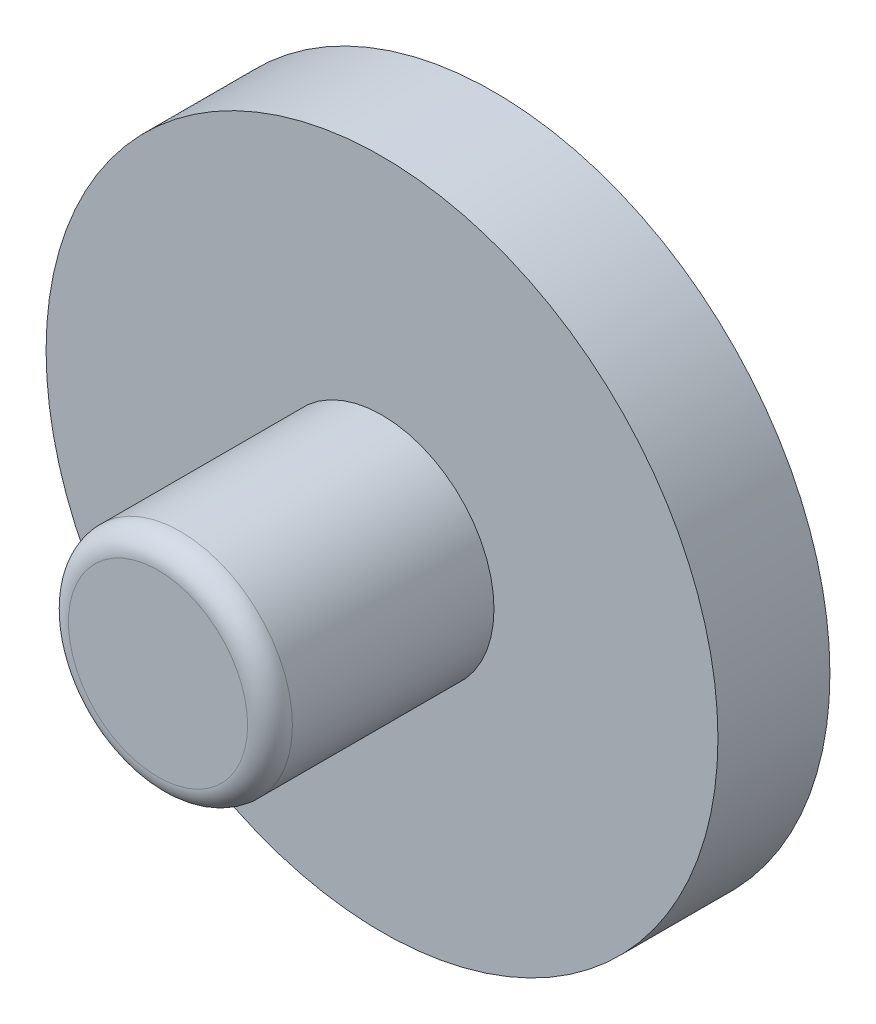
ISO-10303-21;
HEADER;
FILE_DESCRIPTION(('STEP AP214'),'2;1');
FILE_NAME('part.step','',(''),(''),'','','');
FILE_SCHEMA(('AUTOMOTIVE_DESIGN { 1 0 10303 214 1 1 1 1 }'));
ENDSEC;
DATA;
#1=APPLICATION_CONTEXT('core data for automotive mechanical design processes');
#2=APPLICATION_PROTOCOL_DEFINITION('international standard','automotive_design',2000,#1);
#3=PRODUCT_CONTEXT('',#1,'mechanical');
#4=PRODUCT('Part','Part','',(#3));
#5=PRODUCT_RELATED_PRODUCT_CATEGORY('part','',(#4));
#6=PRODUCT_DEFINITION_FORMATION('','',#4);
#7=PRODUCT_DEFINITION_CONTEXT('part definition',#1,'design');
#8=PRODUCT_DEFINITION('design','',#6,#7);
#9=PRODUCT_DEFINITION_SHAPE('','',#8);
#10=(LENGTH_UNIT() NAMED_UNIT(*) SI_UNIT(.MILLI.,.METRE.));
#11=(NAMED_UNIT(*) PLANE_ANGLE_UNIT() SI_UNIT($,.RADIAN.));
#12=(NAMED_UNIT(*) SI_UNIT($,.STERADIAN.) SOLID_ANGLE_UNIT());
#13=UNCERTAINTY_MEASURE_WITH_UNIT(LENGTH_MEASURE(1.E-05),#10,'distance_accuracy_value','');
#14=(GEOMETRIC_REPRESENTATION_CONTEXT(3) GLOBAL_UNCERTAINTY_ASSIGNED_CONTEXT((#13)) GLOBAL_UNIT_ASSIGNED_CONTEXT((#10,
#11,#12)) REPRESENTATION_CONTEXT('',''));
#15=CARTESIAN_POINT('',(0.,0.,0.));
#16=DIRECTION('',(0.,0.,1.));
#17=DIRECTION('',(1.,0.,0.));
#18=AXIS2_PLACEMENT_3D('',#15,#16,#17);
#19=CARTESIAN_POINT('',(0.,0.,1.00000000000003));
#20=DIRECTION('',(0.,0.,1.));
#21=DIRECTION('',(1.,0.,0.));
#22=AXIS2_PLACEMENT_3D('',#19,#20,#21);
#23=PLANE('',#22);
#24=CARTESIAN_POINT('',(0.,0.,1.00000000000003));
#25=DIRECTION('',(0.,0.,1.));
#26=DIRECTION('',(1.,0.,0.));
#27=AXIS2_PLACEMENT_3D('',#24,#25,#26);
#28=CIRCLE('',#27,3.);
#29=CARTESIAN_POINT('',(-3.00000000000002,0.,1.00000000000003));
#30=VERTEX_POINT('',#29);
#31=EDGE_CURVE('E42',#30,#30,#28,.T.);
#32=ORIENTED_EDGE('',*,*,#31,.T.);
#33=EDGE_LOOP('',(#32));
#34=FACE_BOUND('',#33,.T.);
#35=CARTESIAN_POINT('',(0.,0.,1.00000000000003));
#36=DIRECTION('',(0.,0.,1.));
#37=DIRECTION('',(1.,0.,0.));
#38=AXIS2_PLACEMENT_3D('',#35,#36,#37);
#39=CIRCLE('',#38,1.);
#40=CARTESIAN_POINT('',(-1.,0.,1.00000000000003));
#41=VERTEX_POINT('',#40);
#42=EDGE_CURVE('E51',#41,#41,#39,.T.);
#43=ORIENTED_EDGE('',*,*,#42,.F.);
#44=EDGE_LOOP('',(#43));
#45=FACE_BOUND('',#44,.T.);
#46=ADVANCED_FACE('F31',(#34,#45),#23,.T.);
#47=CARTESIAN_POINT('',(0.,0.,1.00000000000003));
#48=DIRECTION('',(0.,0.,-1.));
#49=DIRECTION('',(-1.,0.,0.));
#50=AXIS2_PLACEMENT_3D('',#47,#48,#49);
#51=CYLINDRICAL_SURFACE('',#50,3.);
#52=CARTESIAN_POINT('',(0.,0.,0.));
#53=DIRECTION('',(0.,0.,1.));
#54=DIRECTION('',(1.,0.,0.));
#55=AXIS2_PLACEMENT_3D('',#52,#53,#54);
#56=CIRCLE('',#55,3.);
#57=CARTESIAN_POINT('',(-3.00000000000002,0.,0.));
#58=VERTEX_POINT('',#57);
#59=EDGE_CURVE('E46',#58,#58,#56,.T.);
#60=CARTESIAN_POINT('',(-3.00000000000002,0.,1.00000000000003));
#61=CARTESIAN_POINT('',(-3.00000000000002,0.,0.989583333333361));
#62=CARTESIAN_POINT('',(-3.00000000000002,0.,0.979166666666694));
#63=CARTESIAN_POINT('',(-3.00000000000002,0.,0.95833333333336));
#64=CARTESIAN_POINT('',(-3.00000000000002,0.,0.947916666666693));
#65=CARTESIAN_POINT('',(-3.00000000000002,0.,0.927083333333359));
#66=CARTESIAN_POINT('',(-3.00000000000002,0.,0.916666666666692));
#67=CARTESIAN_POINT('',(-3.00000000000002,0.,0.895833333333358));
#68=CARTESIAN_POINT('',(-3.00000000000002,0.,0.885416666666691));
#69=CARTESIAN_POINT('',(-3.00000000000002,0.,0.864583333333357));
#70=CARTESIAN_POINT('',(-3.00000000000002,0.,0.85416666666669));
#71=CARTESIAN_POINT('',(-3.00000000000002,0.,0.833333333333356));
#72=CARTESIAN_POINT('',(-3.00000000000002,0.,0.82291666666669));
#73=CARTESIAN_POINT('',(-3.00000000000002,0.,0.802083333333356));
#74=CARTESIAN_POINT('',(-3.00000000000002,0.,0.791666666666689));
#75=CARTESIAN_POINT('',(-3.00000000000002,0.,0.770833333333355));
#76=CARTESIAN_POINT('',(-3.00000000000002,0.,0.760416666666688));
#77=CARTESIAN_POINT('',(-3.00000000000002,0.,0.739583333333354));
#78=CARTESIAN_POINT('',(-3.00000000000002,0.,0.729166666666687));
#79=CARTESIAN_POINT('',(-3.00000000000002,0.,0.708333333333353));
#80=CARTESIAN_POINT('',(-3.00000000000002,0.,0.697916666666686));
#81=CARTESIAN_POINT('',(-3.00000000000002,0.,0.677083333333352));
#82=CARTESIAN_POINT('',(-3.00000000000002,0.,0.666666666666685));
#83=CARTESIAN_POINT('',(-3.00000000000002,0.,0.645833333333351));
#84=CARTESIAN_POINT('',(-3.00000000000002,0.,0.635416666666684));
#85=CARTESIAN_POINT('',(-3.00000000000002,0.,0.61458333333335));
#86=CARTESIAN_POINT('',(-3.00000000000002,0.,0.604166666666683));
#87=CARTESIAN_POINT('',(-3.00000000000002,0.,0.583333333333349));
#88=CARTESIAN_POINT('',(-3.00000000000002,0.,0.572916666666682));
#89=CARTESIAN_POINT('',(-3.00000000000002,0.,0.552083333333349));
#90=CARTESIAN_POINT('',(-3.00000000000002,0.,0.541666666666682));
#91=CARTESIAN_POINT('',(-3.00000000000002,0.,0.520833333333348));
#92=CARTESIAN_POINT('',(-3.00000000000002,0.,0.510416666666681));
#93=CARTESIAN_POINT('',(-3.00000000000002,0.,0.489583333333347));
#94=CARTESIAN_POINT('',(-3.00000000000002,0.,0.47916666666668));
#95=CARTESIAN_POINT('',(-3.00000000000002,0.,0.458333333333346));
#96=CARTESIAN_POINT('',(-3.00000000000002,0.,0.447916666666679));
#97=CARTESIAN_POINT('',(-3.00000000000002,0.,0.427083333333345));
#98=CARTESIAN_POINT('',(-3.00000000000002,0.,0.416666666666678));
#99=CARTESIAN_POINT('',(-3.00000000000002,0.,0.395833333333344));
#100=CARTESIAN_POINT('',(-3.00000000000002,0.,0.385416666666677));
#101=CARTESIAN_POINT('',(-3.00000000000002,0.,0.364583333333343));
#102=CARTESIAN_POINT('',(-3.00000000000002,0.,0.354166666666676));
#103=CARTESIAN_POINT('',(-3.00000000000002,0.,0.333333333333342));
#104=CARTESIAN_POINT('',(-3.00000000000002,0.,0.322916666666675));
#105=CARTESIAN_POINT('',(-3.00000000000002,0.,0.302083333333341));
#106=CARTESIAN_POINT('',(-3.00000000000002,0.,0.291666666666674));
#107=CARTESIAN_POINT('',(-3.00000000000002,0.,0.27083333333334));
#108=CARTESIAN_POINT('',(-3.00000000000002,0.,0.260416666666674));
#109=CARTESIAN_POINT('',(-3.00000000000002,0.,0.23958333333334));
#110=CARTESIAN_POINT('',(-3.00000000000002,0.,0.229166666666673));
#111=CARTESIAN_POINT('',(-3.00000000000002,0.,0.208333333333339));
#112=CARTESIAN_POINT('',(-3.00000000000002,0.,0.197916666666672));
#113=CARTESIAN_POINT('',(-3.00000000000002,0.,0.177083333333338));
#114=CARTESIAN_POINT('',(-3.00000000000002,0.,0.166666666666671));
#115=CARTESIAN_POINT('',(-3.00000000000002,0.,0.145833333333337));
#116=CARTESIAN_POINT('',(-3.00000000000002,0.,0.13541666666667));
#117=CARTESIAN_POINT('',(-3.00000000000002,0.,0.114583333333336));
#118=CARTESIAN_POINT('',(-3.00000000000002,0.,0.104166666666669));
#119=CARTESIAN_POINT('',(-3.00000000000002,0.,0.0833333333333352));
#120=CARTESIAN_POINT('',(-3.00000000000002,0.,0.0729166666666682));
#121=CARTESIAN_POINT('',(-3.00000000000002,0.,0.0520833333333343));
#122=CARTESIAN_POINT('',(-3.00000000000002,0.,0.0416666666666673));
#123=CARTESIAN_POINT('',(-3.00000000000002,0.,0.0208333333333333));
#124=CARTESIAN_POINT('',(-3.00000000000002,0.,0.0104166666666664));
#125=CARTESIAN_POINT('',(-3.00000000000002,0.,0.));
#126=B_SPLINE_CURVE_WITH_KNOTS('',3,(#60,#61,#62,#63,#64,#65,#66,#67,#68,#69,#70,#71,#72,#73,
#74,#75,#76,#77,#78,#79,#80,#81,#82,#83,#84,#85,#86,#87,#88,#89,#90,#91,#92,#93,#94,#95,#96,#97,
#98,#99,#100,#101,#102,#103,#104,#105,#106,#107,#108,#109,#110,#111,#112,#113,#114,#115,#116,
#117,#118,#119,#120,#121,#122,#123,#124,#125),.UNSPECIFIED.,.F.,.F.,(4,2,2,2,2,2,2,2,2,2,2,2,2,
2,2,2,2,2,2,2,2,2,2,2,2,2,2,2,2,2,2,2,4),(0.,0.0312500000000008,0.0625000000000017,
0.0937500000000026,0.125000000000003,0.156250000000004,0.187500000000005,0.218750000000006,
0.250000000000007,0.281250000000008,0.312500000000009,0.34375000000001,0.375000000000011,
0.406250000000011,0.437500000000012,0.468750000000013,0.500000000000014,0.531250000000015,
0.562500000000016,0.593750000000017,0.625000000000018,0.656250000000019,0.687500000000019,
0.71875000000002,0.750000000000021,0.781250000000022,0.812500000000023,0.843750000000024,
0.875000000000025,0.906250000000026,0.937500000000027,0.968750000000027,1.00000000000003),.UNSPECIFIED.);
#127=EDGE_CURVE('BSEAM58',#30,#58,#126,.T.);
#128=ORIENTED_EDGE('',*,*,#31,.F.);
#129=ORIENTED_EDGE('',*,*,#59,.T.);
#130=ORIENTED_EDGE('',*,*,#127,.T.);
#131=ORIENTED_EDGE('',*,*,#127,.F.);
#132=EDGE_LOOP('',(#128,#130,#129,#131));
#133=FACE_BOUND('',#132,.T.);
#134=ADVANCED_FACE('F58',(#133),#51,.T.);
#135=CARTESIAN_POINT('',(0.,0.,8.74999999999984));
#136=DIRECTION('',(0.,0.,1.));
#137=DIRECTION('',(1.,0.,0.));
#138=AXIS2_PLACEMENT_3D('',#135,#136,#137);
#139=SPHERICAL_SURFACE('',#138,9.25000000000001);
#140=ORIENTED_EDGE('',*,*,#59,.F.);
#141=EDGE_LOOP('',(#140));
#142=FACE_BOUND('',#141,.T.);
#143=ADVANCED_FACE('F33',(#142),#139,.T.);
#144=CARTESIAN_POINT('',(0.,0.,2.99999999999995));
#145=DIRECTION('',(0.,0.,-1.));
#146=DIRECTION('',(-1.,0.,0.));
#147=AXIS2_PLACEMENT_3D('',#144,#145,#146);
#148=CYLINDRICAL_SURFACE('',#147,1.);
#149=CARTESIAN_POINT('',(0.,0.,2.8));
#150=DIRECTION('',(0.,0.,1.));
#151=DIRECTION('',(1.,0.,0.));
#152=AXIS2_PLACEMENT_3D('',#149,#150,#151);
#153=CIRCLE('',#152,1.);
#154=CARTESIAN_POINT('',(-1.00000000000001,0.,2.8));
#155=VERTEX_POINT('',#154);
#156=EDGE_CURVE('E10',#155,#155,#153,.F.);
#157=CARTESIAN_POINT('',(-1.00000000000001,0.,2.8));
#158=CARTESIAN_POINT('',(-1.00000000000001,0.,2.78125));
#159=CARTESIAN_POINT('',(-1.00000000000001,0.,2.7625));
#160=CARTESIAN_POINT('',(-1.00000000000001,0.,2.725));
#161=CARTESIAN_POINT('',(-1.00000000000001,0.,2.70625));
#162=CARTESIAN_POINT('',(-1.00000000000001,0.,2.66875));
#163=CARTESIAN_POINT('',(-1.00000000000001,0.,2.65));
#164=CARTESIAN_POINT('',(-1.00000000000001,0.,2.6125));
#165=CARTESIAN_POINT('',(-1.00000000000001,0.,2.59375));
#166=CARTESIAN_POINT('',(-1.00000000000001,0.,2.55625));
#167=CARTESIAN_POINT('',(-1.00000000000001,0.,2.5375));
#168=CARTESIAN_POINT('',(-1.00000000000001,0.,2.5));
#169=CARTESIAN_POINT('',(-1.00000000000001,0.,2.48125));
#170=CARTESIAN_POINT('',(-1.00000000000001,0.,2.44375));
#171=CARTESIAN_POINT('',(-1.00000000000001,0.,2.425));
#172=CARTESIAN_POINT('',(-1.00000000000001,0.,2.3875));
#173=CARTESIAN_POINT('',(-1.00000000000001,0.,2.36875));
#174=CARTESIAN_POINT('',(-1.00000000000001,0.,2.33125));
#175=CARTESIAN_POINT('',(-1.00000000000001,0.,2.3125));
#176=CARTESIAN_POINT('',(-1.00000000000001,0.,2.27500000000001));
#177=CARTESIAN_POINT('',(-1.00000000000001,0.,2.25625000000001));
#178=CARTESIAN_POINT('',(-1.00000000000001,0.,2.21875000000001));
#179=CARTESIAN_POINT('',(-1.00000000000001,0.,2.20000000000001));
#180=CARTESIAN_POINT('',(-1.00000000000001,0.,2.16250000000001));
#181=CARTESIAN_POINT('',(-1.00000000000001,0.,2.14375000000001));
#182=CARTESIAN_POINT('',(-1.00000000000001,0.,2.10625000000001));
#183=CARTESIAN_POINT('',(-1.00000000000001,0.,2.08750000000001));
#184=CARTESIAN_POINT('',(-1.00000000000001,0.,2.05000000000001));
#185=CARTESIAN_POINT('',(-1.00000000000001,0.,2.03125000000001));
#186=CARTESIAN_POINT('',(-1.00000000000001,0.,1.99375000000001));
#187=CARTESIAN_POINT('',(-1.00000000000001,0.,1.97500000000001));
#188=CARTESIAN_POINT('',(-1.00000000000001,0.,1.93750000000001));
#189=CARTESIAN_POINT('',(-1.00000000000001,0.,1.91875000000001));
#190=CARTESIAN_POINT('',(-1.00000000000001,0.,1.88125000000001));
#191=CARTESIAN_POINT('',(-1.00000000000001,0.,1.86250000000001));
#192=CARTESIAN_POINT('',(-1.00000000000001,0.,1.82500000000001));
#193=CARTESIAN_POINT('',(-1.00000000000001,0.,1.80625000000001));
#194=CARTESIAN_POINT('',(-1.00000000000001,0.,1.76875000000001));
#195=CARTESIAN_POINT('',(-1.00000000000001,0.,1.75000000000002));
#196=CARTESIAN_POINT('',(-1.00000000000001,0.,1.71250000000002));
#197=CARTESIAN_POINT('',(-1.00000000000001,0.,1.69375000000002));
#198=CARTESIAN_POINT('',(-1.00000000000001,0.,1.65625000000002));
#199=CARTESIAN_POINT('',(-1.00000000000001,0.,1.63750000000002));
#200=CARTESIAN_POINT('',(-1.00000000000001,0.,1.60000000000002));
#201=CARTESIAN_POINT('',(-1.00000000000001,0.,1.58125000000002));
#202=CARTESIAN_POINT('',(-1.00000000000001,0.,1.54375000000002));
#203=CARTESIAN_POINT('',(-1.,0.,1.52500000000002));
#204=CARTESIAN_POINT('',(-1.,0.,1.48750000000002));
#205=CARTESIAN_POINT('',(-1.,0.,1.46875000000002));
#206=CARTESIAN_POINT('',(-1.,0.,1.43125000000002));
#207=CARTESIAN_POINT('',(-1.,0.,1.41250000000002));
#208=CARTESIAN_POINT('',(-1.,0.,1.37500000000002));
#209=CARTESIAN_POINT('',(-1.,0.,1.35625000000002));
#210=CARTESIAN_POINT('',(-1.,0.,1.31875000000002));
#211=CARTESIAN_POINT('',(-1.,0.,1.30000000000002));
#212=CARTESIAN_POINT('',(-1.,0.,1.26250000000002));
#213=CARTESIAN_POINT('',(-1.,0.,1.24375000000002));
#214=CARTESIAN_POINT('',(-1.,0.,1.20625000000002));
#215=CARTESIAN_POINT('',(-1.,0.,1.18750000000002));
#216=CARTESIAN_POINT('',(-1.,0.,1.15000000000003));
#217=CARTESIAN_POINT('',(-1.,0.,1.13125000000003));
#218=CARTESIAN_POINT('',(-1.,0.,1.09375000000003));
#219=CARTESIAN_POINT('',(-1.,0.,1.07500000000003));
#220=CARTESIAN_POINT('',(-1.,0.,1.03750000000003));
#221=CARTESIAN_POINT('',(-1.,0.,1.01875000000003));
#222=CARTESIAN_POINT('',(-1.,0.,1.00000000000003));
#223=B_SPLINE_CURVE_WITH_KNOTS('',3,(#157,#158,#159,#160,#161,#162,#163,#164,#165,#166,#167,
#168,#169,#170,#171,#172,#173,#174,#175,#176,#177,#178,#179,#180,#181,#182,#183,#184,#185,#186,
#187,#188,#189,#190,#191,#192,#193,#194,#195,#196,#197,#198,#199,#200,#201,#202,#203,#204,#205,
#206,#207,#208,#209,#210,#211,#212,#213,#214,#215,#216,#217,#218,#219,#220,#221,#222),
.UNSPECIFIED.,.F.,.F.,(4,2,2,2,2,2,2,2,2,2,2,2,2,2,2,2,2,2,2,2,2,2,2,2,2,2,2,2,2,2,2,2,4),(0.,
0.056249999999999,0.112499999999998,0.168749999999997,0.224999999999996,0.281249999999996,
0.337499999999994,0.393749999999993,0.449999999999993,0.506249999999992,0.56249999999999,
0.618749999999989,0.674999999999988,0.731249999999987,0.787499999999987,0.843749999999986,
0.899999999999985,0.956249999999984,1.01249999999998,1.06874999999998,1.12499999999998,
1.18124999999998,1.23749999999998,1.29374999999998,1.34999999999998,1.40624999999998,
1.46249999999997,1.51874999999997,1.57499999999997,1.63124999999997,1.68749999999997,
1.74374999999997,1.79999999999997),.UNSPECIFIED.);
#224=EDGE_CURVE('BSEAM55',#155,#41,#223,.T.);
#225=ORIENTED_EDGE('',*,*,#156,.T.);
#226=ORIENTED_EDGE('',*,*,#42,.T.);
#227=ORIENTED_EDGE('',*,*,#224,.T.);
#228=ORIENTED_EDGE('',*,*,#224,.F.);
#229=EDGE_LOOP('',(#225,#227,#226,#228));
#230=FACE_BOUND('',#229,.T.);
#231=ADVANCED_FACE('F55',(#230),#148,.T.);
#232=CARTESIAN_POINT('',(0.,0.,2.99999999999995));
#233=DIRECTION('',(0.,0.,1.));
#234=DIRECTION('',(1.,0.,0.));
#235=AXIS2_PLACEMENT_3D('',#232,#233,#234);
#236=PLANE('',#235);
#237=CARTESIAN_POINT('',(0.,0.,2.99999999999995));
#238=DIRECTION('',(0.,0.,1.));
#239=DIRECTION('',(1.,0.,0.));
#240=AXIS2_PLACEMENT_3D('',#237,#238,#239);
#241=CIRCLE('',#240,0.8);
#242=CARTESIAN_POINT('',(0.799999999999995,0.,2.99999999999995));
#243=VERTEX_POINT('',#242);
#244=EDGE_CURVE('E38',#243,#243,#241,.T.);
#245=ORIENTED_EDGE('',*,*,#244,.T.);
#246=EDGE_LOOP('',(#245));
#247=FACE_BOUND('',#246,.T.);
#248=ADVANCED_FACE('F68',(#247),#236,.T.);
#249=CARTESIAN_POINT('',(0.,0.,2.8));
#250=DIRECTION('',(0.,0.,1.));
#251=DIRECTION('',(1.,0.,0.));
#252=AXIS2_PLACEMENT_3D('',#249,#250,#251);
#253=TOROIDAL_SURFACE('',#252,0.8,0.2);
#254=ORIENTED_EDGE('',*,*,#156,.F.);
#255=EDGE_LOOP('',(#254));
#256=FACE_BOUND('',#255,.T.);
#257=ORIENTED_EDGE('',*,*,#244,.F.);
#258=EDGE_LOOP('',(#257));
#259=FACE_BOUND('',#258,.T.);
#260=ADVANCED_FACE('F71',(#256,#259),#253,.T.);
#261=CLOSED_SHELL('',(#46,#134,#143,#231,#248,#260));
#262=MANIFOLD_SOLID_BREP('B2',#261);
#263=ADVANCED_BREP_SHAPE_REPRESENTATION('',(#18,#262),#14);
#264=SHAPE_DEFINITION_REPRESENTATION(#9,#263);
ENDSEC;
END-ISO-10303-21;
